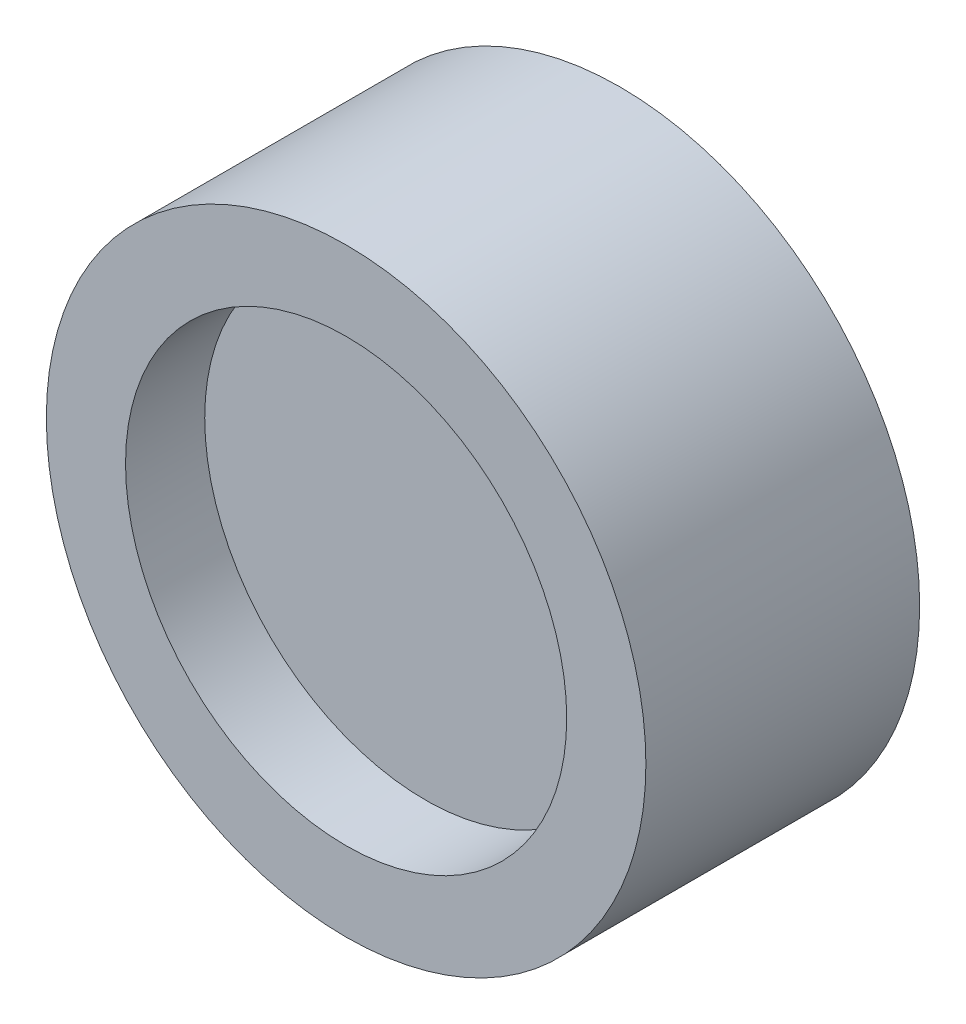
ISO-10303-21;
HEADER;
FILE_DESCRIPTION(('STEP AP214'),'2;1');
FILE_NAME('part.step','',(''),(''),'','','');
FILE_SCHEMA(('AUTOMOTIVE_DESIGN { 1 0 10303 214 1 1 1 1 }'));
ENDSEC;
DATA;
#1=APPLICATION_CONTEXT('core data for automotive mechanical design processes');
#2=APPLICATION_PROTOCOL_DEFINITION('international standard','automotive_design',2000,#1);
#3=PRODUCT_CONTEXT('',#1,'mechanical');
#4=PRODUCT('Part','Part','',(#3));
#5=PRODUCT_RELATED_PRODUCT_CATEGORY('part','',(#4));
#6=PRODUCT_DEFINITION_FORMATION('','',#4);
#7=PRODUCT_DEFINITION_CONTEXT('part definition',#1,'design');
#8=PRODUCT_DEFINITION('design','',#6,#7);
#9=PRODUCT_DEFINITION_SHAPE('','',#8);
#10=(LENGTH_UNIT() NAMED_UNIT(*) SI_UNIT(.MILLI.,.METRE.));
#11=(NAMED_UNIT(*) PLANE_ANGLE_UNIT() SI_UNIT($,.RADIAN.));
#12=(NAMED_UNIT(*) SI_UNIT($,.STERADIAN.) SOLID_ANGLE_UNIT());
#13=UNCERTAINTY_MEASURE_WITH_UNIT(LENGTH_MEASURE(1.E-05),#10,'distance_accuracy_value','');
#14=(GEOMETRIC_REPRESENTATION_CONTEXT(3) GLOBAL_UNCERTAINTY_ASSIGNED_CONTEXT((#13)) GLOBAL_UNIT_ASSIGNED_CONTEXT((#10,
#11,#12)) REPRESENTATION_CONTEXT('',''));
#15=CARTESIAN_POINT('',(0.,0.,0.));
#16=DIRECTION('',(0.,0.,1.));
#17=DIRECTION('',(1.,0.,0.));
#18=AXIS2_PLACEMENT_3D('',#15,#16,#17);
#19=CARTESIAN_POINT('',(0.,0.,4.));
#20=DIRECTION('',(0.,0.,1.));
#21=DIRECTION('',(1.,0.,0.));
#22=AXIS2_PLACEMENT_3D('',#19,#20,#21);
#23=CYLINDRICAL_SURFACE('',#22,3.);
#24=CARTESIAN_POINT('',(0.,0.,4.));
#25=DIRECTION('',(0.,0.,-1.));
#26=DIRECTION('',(-1.,0.,0.));
#27=AXIS2_PLACEMENT_3D('',#24,#25,#26);
#28=CIRCLE('',#27,3.);
#29=CARTESIAN_POINT('',(-3.,0.,4.));
#30=VERTEX_POINT('',#29);
#31=EDGE_CURVE('E11',#30,#30,#28,.T.);
#32=ORIENTED_EDGE('',*,*,#31,.F.);
#33=EDGE_LOOP('',(#32));
#34=FACE_BOUND('',#33,.T.);
#35=CARTESIAN_POINT('',(0.,0.,7.));
#36=DIRECTION('',(0.,0.,-1.));
#37=DIRECTION('',(-1.,0.,0.));
#38=AXIS2_PLACEMENT_3D('',#35,#36,#37);
#39=CIRCLE('',#38,3.);
#40=CARTESIAN_POINT('',(-3.,0.,7.));
#41=VERTEX_POINT('',#40);
#42=EDGE_CURVE('E43',#41,#41,#39,.T.);
#43=ORIENTED_EDGE('',*,*,#42,.T.);
#44=EDGE_LOOP('',(#43));
#45=FACE_BOUND('',#44,.T.);
#46=ADVANCED_FACE('F40',(#34,#45),#23,.T.);
#47=CARTESIAN_POINT('',(0.,0.,4.));
#48=DIRECTION('',(0.,0.,-1.));
#49=DIRECTION('',(-1.,0.,0.));
#50=AXIS2_PLACEMENT_3D('',#47,#48,#49);
#51=PLANE('',#50);
#52=ORIENTED_EDGE('',*,*,#31,.T.);
#53=EDGE_LOOP('',(#52));
#54=FACE_BOUND('',#53,.T.);
#55=ADVANCED_FACE('F55',(#54),#51,.T.);
#56=CARTESIAN_POINT('',(0.,0.,7.));
#57=DIRECTION('',(0.,0.,-1.));
#58=DIRECTION('',(-1.,0.,0.));
#59=AXIS2_PLACEMENT_3D('',#56,#57,#58);
#60=PLANE('',#59);
#61=ORIENTED_EDGE('',*,*,#42,.F.);
#62=EDGE_LOOP('',(#61));
#63=FACE_BOUND('',#62,.T.);
#64=ADVANCED_FACE('F53',(#63),#60,.F.);
#65=CLOSED_SHELL('',(#46,#55,#64));
#66=MANIFOLD_SOLID_BREP('B2',#65);
#67=CARTESIAN_POINT('',(0.,0.,24.2));
#68=DIRECTION('',(0.,0.,-1.));
#69=DIRECTION('',(-1.,0.,0.));
#70=AXIS2_PLACEMENT_3D('',#67,#68,#69);
#71=CYLINDRICAL_SURFACE('',#70,19.5);
#72=CARTESIAN_POINT('',(0.,0.,24.2));
#73=DIRECTION('',(0.,0.,1.));
#74=DIRECTION('',(1.,0.,0.));
#75=AXIS2_PLACEMENT_3D('',#72,#73,#74);
#76=CIRCLE('',#75,19.5);
#77=CARTESIAN_POINT('',(19.5,0.,24.2));
#78=VERTEX_POINT('',#77);
#79=EDGE_CURVE('E96',#78,#78,#76,.T.);
#80=ORIENTED_EDGE('',*,*,#79,.T.);
#81=EDGE_LOOP('',(#80));
#82=FACE_BOUND('',#81,.T.);
#83=CARTESIAN_POINT('',(0.,0.,17.2));
#84=DIRECTION('',(0.,0.,-1.));
#85=DIRECTION('',(-1.,0.,0.));
#86=AXIS2_PLACEMENT_3D('',#83,#84,#85);
#87=CIRCLE('',#86,19.5);
#88=CARTESIAN_POINT('',(-19.5,0.,17.2));
#89=VERTEX_POINT('',#88);
#90=EDGE_CURVE('E101',#89,#89,#87,.T.);
#91=ORIENTED_EDGE('',*,*,#90,.T.);
#92=EDGE_LOOP('',(#91));
#93=FACE_BOUND('',#92,.T.);
#94=ADVANCED_FACE('F80',(#82,#93),#71,.F.);
#95=CARTESIAN_POINT('',(0.,0.,24.2));
#96=DIRECTION('',(0.,0.,1.));
#97=DIRECTION('',(1.,0.,0.));
#98=AXIS2_PLACEMENT_3D('',#95,#96,#97);
#99=PLANE('',#98);
#100=CARTESIAN_POINT('',(0.,0.,24.2));
#101=DIRECTION('',(0.,0.,1.));
#102=DIRECTION('',(1.,0.,0.));
#103=AXIS2_PLACEMENT_3D('',#100,#101,#102);
#104=CIRCLE('',#103,26.5);
#105=CARTESIAN_POINT('',(26.5,0.,24.2));
#106=VERTEX_POINT('',#105);
#107=EDGE_CURVE('E87',#106,#106,#104,.T.);
#108=ORIENTED_EDGE('',*,*,#107,.T.);
#109=EDGE_LOOP('',(#108));
#110=FACE_BOUND('',#109,.T.);
#111=ORIENTED_EDGE('',*,*,#79,.F.);
#112=EDGE_LOOP('',(#111));
#113=FACE_BOUND('',#112,.T.);
#114=ADVANCED_FACE('F118',(#110,#113),#99,.T.);
#115=CARTESIAN_POINT('',(0.,0.,0.));
#116=DIRECTION('',(0.,0.,1.));
#117=DIRECTION('',(1.,0.,0.));
#118=AXIS2_PLACEMENT_3D('',#115,#116,#117);
#119=PLANE('',#118);
#120=CARTESIAN_POINT('',(0.,0.,0.));
#121=DIRECTION('',(0.,0.,1.));
#122=DIRECTION('',(1.,0.,0.));
#123=AXIS2_PLACEMENT_3D('',#120,#121,#122);
#124=CIRCLE('',#123,26.5);
#125=CARTESIAN_POINT('',(26.5,0.,0.));
#126=VERTEX_POINT('',#125);
#127=EDGE_CURVE('E91',#126,#126,#124,.T.);
#128=ORIENTED_EDGE('',*,*,#127,.F.);
#129=EDGE_LOOP('',(#128));
#130=FACE_BOUND('',#129,.T.);
#131=CARTESIAN_POINT('',(0.,0.,0.));
#132=DIRECTION('',(0.,0.,1.));
#133=DIRECTION('',(1.,0.,0.));
#134=AXIS2_PLACEMENT_3D('',#131,#132,#133);
#135=CIRCLE('',#134,19.5);
#136=CARTESIAN_POINT('',(19.5,0.,0.));
#137=VERTEX_POINT('',#136);
#138=EDGE_CURVE('E98',#137,#137,#135,.T.);
#139=ORIENTED_EDGE('',*,*,#138,.T.);
#140=EDGE_LOOP('',(#139));
#141=FACE_BOUND('',#140,.T.);
#142=ADVANCED_FACE('F124',(#130,#141),#119,.F.);
#143=CARTESIAN_POINT('',(0.,0.,24.2));
#144=DIRECTION('',(0.,0.,-1.));
#145=DIRECTION('',(-1.,0.,0.));
#146=AXIS2_PLACEMENT_3D('',#143,#144,#145);
#147=CYLINDRICAL_SURFACE('',#146,26.5);
#148=ORIENTED_EDGE('',*,*,#107,.F.);
#149=EDGE_LOOP('',(#148));
#150=FACE_BOUND('',#149,.T.);
#151=ORIENTED_EDGE('',*,*,#127,.T.);
#152=EDGE_LOOP('',(#151));
#153=FACE_BOUND('',#152,.T.);
#154=ADVANCED_FACE('F82',(#150,#153),#147,.T.);
#155=CARTESIAN_POINT('',(0.,0.,7.));
#156=DIRECTION('',(0.,0.,-1.));
#157=DIRECTION('',(-1.,0.,0.));
#158=AXIS2_PLACEMENT_3D('',#155,#156,#157);
#159=CIRCLE('',#158,19.5);
#160=CARTESIAN_POINT('',(-19.5,0.,7.));
#161=VERTEX_POINT('',#160);
#162=EDGE_CURVE('E39',#161,#161,#159,.T.);
#163=ORIENTED_EDGE('',*,*,#162,.F.);
#164=EDGE_LOOP('',(#163));
#165=FACE_BOUND('',#164,.T.);
#166=ORIENTED_EDGE('',*,*,#138,.F.);
#167=EDGE_LOOP('',(#166));
#168=FACE_BOUND('',#167,.T.);
#169=ADVANCED_FACE('F115',(#165,#168),#71,.F.);
#170=CARTESIAN_POINT('',(0.,0.,7.));
#171=DIRECTION('',(0.,0.,-1.));
#172=DIRECTION('',(-1.,0.,0.));
#173=AXIS2_PLACEMENT_3D('',#170,#171,#172);
#174=PLANE('',#173);
#175=ORIENTED_EDGE('',*,*,#162,.T.);
#176=EDGE_LOOP('',(#175));
#177=FACE_BOUND('',#176,.T.);
#178=ADVANCED_FACE('F110',(#177),#174,.T.);
#179=CARTESIAN_POINT('',(0.,0.,17.2));
#180=DIRECTION('',(0.,0.,-1.));
#181=DIRECTION('',(-1.,0.,0.));
#182=AXIS2_PLACEMENT_3D('',#179,#180,#181);
#183=PLANE('',#182);
#184=ORIENTED_EDGE('',*,*,#90,.F.);
#185=EDGE_LOOP('',(#184));
#186=FACE_BOUND('',#185,.T.);
#187=ADVANCED_FACE('F108',(#186),#183,.F.);
#188=CLOSED_SHELL('',(#94,#114,#142,#154,#169,#178,#187));
#189=MANIFOLD_SOLID_BREP('B6',#188);
#190=ADVANCED_BREP_SHAPE_REPRESENTATION('',(#18,#66,#189),#14);
#191=SHAPE_DEFINITION_REPRESENTATION(#9,#190);
ENDSEC;
END-ISO-10303-21;
